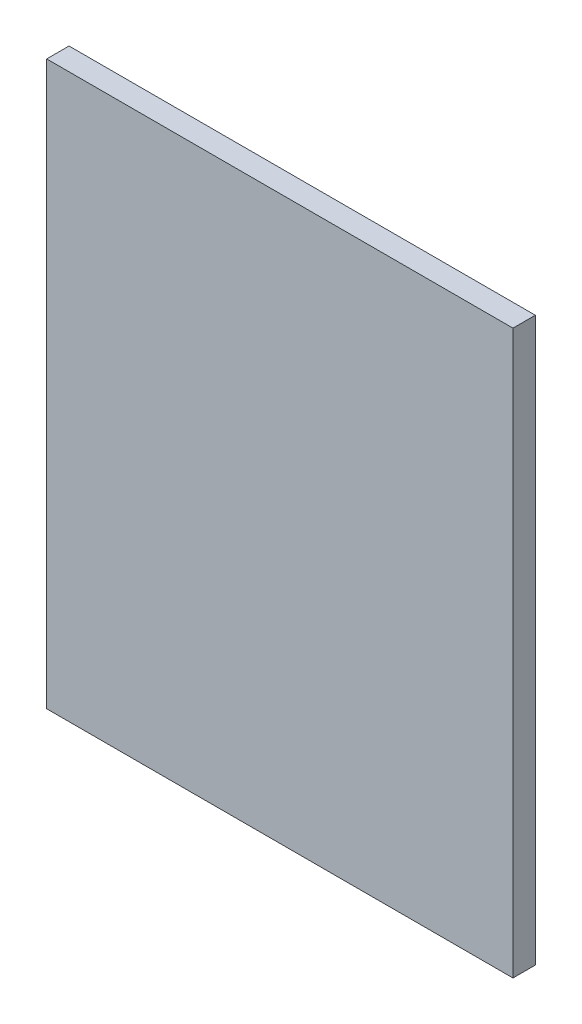
ISO-10303-21;
HEADER;
FILE_DESCRIPTION(('STEP AP214'),'2;1');
FILE_NAME('part.step','',(''),(''),'','','');
FILE_SCHEMA(('AUTOMOTIVE_DESIGN { 1 0 10303 214 1 1 1 1 }'));
ENDSEC;
DATA;
#1=APPLICATION_CONTEXT('core data for automotive mechanical design processes');
#2=APPLICATION_PROTOCOL_DEFINITION('international standard','automotive_design',2000,#1);
#3=PRODUCT_CONTEXT('',#1,'mechanical');
#4=PRODUCT('Part','Part','',(#3));
#5=PRODUCT_RELATED_PRODUCT_CATEGORY('part','',(#4));
#6=PRODUCT_DEFINITION_FORMATION('','',#4);
#7=PRODUCT_DEFINITION_CONTEXT('part definition',#1,'design');
#8=PRODUCT_DEFINITION('design','',#6,#7);
#9=PRODUCT_DEFINITION_SHAPE('','',#8);
#10=(LENGTH_UNIT() NAMED_UNIT(*) SI_UNIT(.MILLI.,.METRE.));
#11=(NAMED_UNIT(*) PLANE_ANGLE_UNIT() SI_UNIT($,.RADIAN.));
#12=(NAMED_UNIT(*) SI_UNIT($,.STERADIAN.) SOLID_ANGLE_UNIT());
#13=UNCERTAINTY_MEASURE_WITH_UNIT(LENGTH_MEASURE(1.E-05),#10,'distance_accuracy_value','');
#14=(GEOMETRIC_REPRESENTATION_CONTEXT(3) GLOBAL_UNCERTAINTY_ASSIGNED_CONTEXT((#13)) GLOBAL_UNIT_ASSIGNED_CONTEXT((#10,
#11,#12)) REPRESENTATION_CONTEXT('',''));
#15=CARTESIAN_POINT('',(0.,0.,0.));
#16=DIRECTION('',(0.,0.,1.));
#17=DIRECTION('',(1.,0.,0.));
#18=AXIS2_PLACEMENT_3D('',#15,#16,#17);
#19=CARTESIAN_POINT('',(-30.0684878990864,22.458699574031,3.));
#20=DIRECTION('',(1.,0.,0.));
#21=DIRECTION('',(0.,0.,-1.));
#22=AXIS2_PLACEMENT_3D('',#19,#20,#21);
#23=PLANE('',#22);
#24=DIRECTION('',(0.,-1.,0.));
#25=VECTOR('',#24,1.);
#26=CARTESIAN_POINT('',(-30.0684878990864,22.458699574031,0.));
#27=LINE('',#26,#25);
#28=CARTESIAN_POINT('',(-30.0684878990864,22.458699574031,0.));
#29=VERTEX_POINT('',#28);
#30=CARTESIAN_POINT('',(-30.0684878990864,-53.0815437273873,0.));
#31=VERTEX_POINT('',#30);
#32=EDGE_CURVE('E96',#29,#31,#27,.T.);
#33=ORIENTED_EDGE('',*,*,#32,.T.);
#34=DIRECTION('',(0.,0.,-1.));
#35=VECTOR('',#34,1.);
#36=CARTESIAN_POINT('',(-30.0684878990864,-53.0815437273873,3.));
#37=LINE('',#36,#35);
#38=CARTESIAN_POINT('',(-30.0684878990864,-53.0815437273873,3.));
#39=VERTEX_POINT('',#38);
#40=EDGE_CURVE('E11',#39,#31,#37,.T.);
#41=ORIENTED_EDGE('',*,*,#40,.F.);
#42=DIRECTION('',(0.,-1.,0.));
#43=VECTOR('',#42,1.);
#44=CARTESIAN_POINT('',(-30.0684878990864,22.458699574031,3.));
#45=LINE('',#44,#43);
#46=CARTESIAN_POINT('',(-30.0684878990864,22.458699574031,3.));
#47=VERTEX_POINT('',#46);
#48=EDGE_CURVE('E84',#47,#39,#45,.T.);
#49=ORIENTED_EDGE('',*,*,#48,.F.);
#50=DIRECTION('',(0.,0.,-1.));
#51=VECTOR('',#50,1.);
#52=CARTESIAN_POINT('',(-30.0684878990864,22.458699574031,3.));
#53=LINE('',#52,#51);
#54=EDGE_CURVE('E92',#47,#29,#53,.T.);
#55=ORIENTED_EDGE('',*,*,#54,.T.);
#56=EDGE_LOOP('',(#33,#41,#49,#55));
#57=FACE_BOUND('',#56,.T.);
#58=ADVANCED_FACE('F33',(#57),#23,.F.);
#59=CARTESIAN_POINT('',(-30.0684878990864,-53.0815437273873,3.));
#60=DIRECTION('',(0.,1.,0.));
#61=DIRECTION('',(0.,0.,1.));
#62=AXIS2_PLACEMENT_3D('',#59,#60,#61);
#63=PLANE('',#62);
#64=DIRECTION('',(1.,0.,0.));
#65=VECTOR('',#64,1.);
#66=CARTESIAN_POINT('',(-30.0684878990864,-53.0815437273873,0.));
#67=LINE('',#66,#65);
#68=CARTESIAN_POINT('',(32.5182330556686,-53.0815437273873,0.));
#69=VERTEX_POINT('',#68);
#70=EDGE_CURVE('E88',#31,#69,#67,.T.);
#71=ORIENTED_EDGE('',*,*,#70,.T.);
#72=DIRECTION('',(0.,0.,-1.));
#73=VECTOR('',#72,1.);
#74=CARTESIAN_POINT('',(32.5182330556686,-53.0815437273873,3.));
#75=LINE('',#74,#73);
#76=CARTESIAN_POINT('',(32.5182330556686,-53.0815437273873,3.));
#77=VERTEX_POINT('',#76);
#78=EDGE_CURVE('E41',#77,#69,#75,.T.);
#79=ORIENTED_EDGE('',*,*,#78,.F.);
#80=DIRECTION('',(1.,0.,0.));
#81=VECTOR('',#80,1.);
#82=CARTESIAN_POINT('',(-30.0684878990864,-53.0815437273873,3.));
#83=LINE('',#82,#81);
#84=EDGE_CURVE('E79',#39,#77,#83,.T.);
#85=ORIENTED_EDGE('',*,*,#84,.F.);
#86=ORIENTED_EDGE('',*,*,#40,.T.);
#87=EDGE_LOOP('',(#71,#79,#85,#86));
#88=FACE_BOUND('',#87,.T.);
#89=ADVANCED_FACE('F87',(#88),#63,.F.);
#90=CARTESIAN_POINT('',(32.5182330556686,22.458699574031,3.));
#91=DIRECTION('',(-1.,0.,0.));
#92=DIRECTION('',(0.,0.,1.));
#93=AXIS2_PLACEMENT_3D('',#90,#91,#92);
#94=PLANE('',#93);
#95=DIRECTION('',(0.,1.,0.));
#96=VECTOR('',#95,1.);
#97=CARTESIAN_POINT('',(32.5182330556686,22.458699574031,0.));
#98=LINE('',#97,#96);
#99=CARTESIAN_POINT('',(32.5182330556686,22.458699574031,0.));
#100=VERTEX_POINT('',#99);
#101=EDGE_CURVE('E66',#69,#100,#98,.T.);
#102=ORIENTED_EDGE('',*,*,#101,.T.);
#103=DIRECTION('',(0.,0.,-1.));
#104=VECTOR('',#103,1.);
#105=CARTESIAN_POINT('',(32.5182330556686,22.458699574031,3.));
#106=LINE('',#105,#104);
#107=CARTESIAN_POINT('',(32.5182330556686,22.458699574031,3.));
#108=VERTEX_POINT('',#107);
#109=EDGE_CURVE('E89',#108,#100,#106,.T.);
#110=ORIENTED_EDGE('',*,*,#109,.F.);
#111=DIRECTION('',(0.,1.,0.));
#112=VECTOR('',#111,1.);
#113=CARTESIAN_POINT('',(32.5182330556686,22.458699574031,3.));
#114=LINE('',#113,#112);
#115=EDGE_CURVE('E82',#77,#108,#114,.T.);
#116=ORIENTED_EDGE('',*,*,#115,.F.);
#117=ORIENTED_EDGE('',*,*,#78,.T.);
#118=EDGE_LOOP('',(#102,#110,#116,#117));
#119=FACE_BOUND('',#118,.T.);
#120=ADVANCED_FACE('F90',(#119),#94,.F.);
#121=CARTESIAN_POINT('',(-30.0684878990864,22.458699574031,3.));
#122=DIRECTION('',(0.,-1.,0.));
#123=DIRECTION('',(0.,0.,-1.));
#124=AXIS2_PLACEMENT_3D('',#121,#122,#123);
#125=PLANE('',#124);
#126=DIRECTION('',(-1.,0.,0.));
#127=VECTOR('',#126,1.);
#128=CARTESIAN_POINT('',(-30.0684878990864,22.458699574031,0.));
#129=LINE('',#128,#127);
#130=EDGE_CURVE('E72',#100,#29,#129,.T.);
#131=ORIENTED_EDGE('',*,*,#130,.T.);
#132=ORIENTED_EDGE('',*,*,#54,.F.);
#133=DIRECTION('',(-1.,0.,0.));
#134=VECTOR('',#133,1.);
#135=CARTESIAN_POINT('',(-30.0684878990864,22.458699574031,3.));
#136=LINE('',#135,#134);
#137=EDGE_CURVE('E49',#108,#47,#136,.T.);
#138=ORIENTED_EDGE('',*,*,#137,.F.);
#139=ORIENTED_EDGE('',*,*,#109,.T.);
#140=EDGE_LOOP('',(#131,#132,#138,#139));
#141=FACE_BOUND('',#140,.T.);
#142=ADVANCED_FACE('F103',(#141),#125,.F.);
#143=CARTESIAN_POINT('',(0.,0.,3.));
#144=DIRECTION('',(0.,0.,1.));
#145=DIRECTION('',(1.,0.,0.));
#146=AXIS2_PLACEMENT_3D('',#143,#144,#145);
#147=PLANE('',#146);
#148=ORIENTED_EDGE('',*,*,#48,.T.);
#149=ORIENTED_EDGE('',*,*,#84,.T.);
#150=ORIENTED_EDGE('',*,*,#115,.T.);
#151=ORIENTED_EDGE('',*,*,#137,.T.);
#152=EDGE_LOOP('',(#148,#149,#150,#151));
#153=FACE_BOUND('',#152,.T.);
#154=ADVANCED_FACE('F80',(#153),#147,.T.);
#155=CARTESIAN_POINT('',(0.,0.,0.));
#156=DIRECTION('',(0.,0.,1.));
#157=DIRECTION('',(1.,0.,0.));
#158=AXIS2_PLACEMENT_3D('',#155,#156,#157);
#159=PLANE('',#158);
#160=ORIENTED_EDGE('',*,*,#32,.F.);
#161=ORIENTED_EDGE('',*,*,#130,.F.);
#162=ORIENTED_EDGE('',*,*,#101,.F.);
#163=ORIENTED_EDGE('',*,*,#70,.F.);
#164=EDGE_LOOP('',(#160,#161,#162,#163));
#165=FACE_BOUND('',#164,.T.);
#166=ADVANCED_FACE('F106',(#165),#159,.F.);
#167=CLOSED_SHELL('',(#58,#89,#120,#142,#154,#166));
#168=MANIFOLD_SOLID_BREP('B2',#167);
#169=ADVANCED_BREP_SHAPE_REPRESENTATION('',(#18,#168),#14);
#170=SHAPE_DEFINITION_REPRESENTATION(#9,#169);
ENDSEC;
END-ISO-10303-21;
